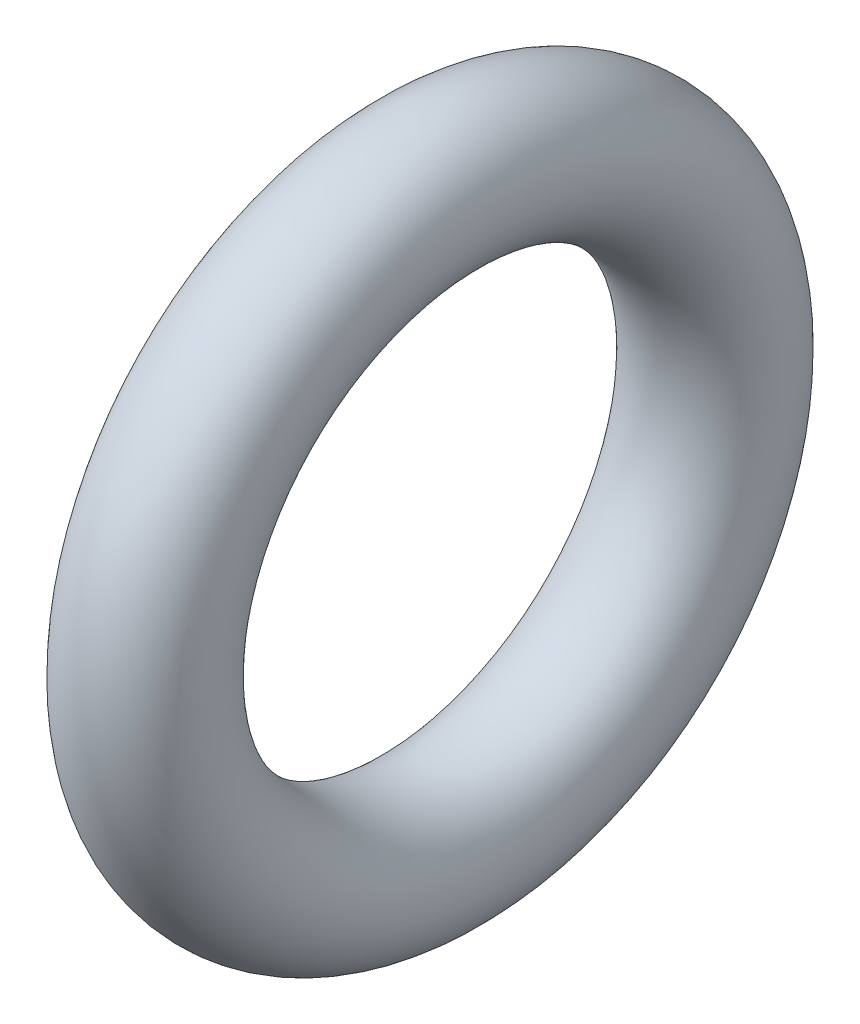
ISO-10303-21;
HEADER;
FILE_DESCRIPTION(('STEP AP214'),'2;1');
FILE_NAME('part.step','',(''),(''),'','','');
FILE_SCHEMA(('AUTOMOTIVE_DESIGN { 1 0 10303 214 1 1 1 1 }'));
ENDSEC;
DATA;
#1=APPLICATION_CONTEXT('core data for automotive mechanical design processes');
#2=APPLICATION_PROTOCOL_DEFINITION('international standard','automotive_design',2000,#1);
#3=PRODUCT_CONTEXT('',#1,'mechanical');
#4=PRODUCT('Part','Part','',(#3));
#5=PRODUCT_RELATED_PRODUCT_CATEGORY('part','',(#4));
#6=PRODUCT_DEFINITION_FORMATION('','',#4);
#7=PRODUCT_DEFINITION_CONTEXT('part definition',#1,'design');
#8=PRODUCT_DEFINITION('design','',#6,#7);
#9=PRODUCT_DEFINITION_SHAPE('','',#8);
#10=(LENGTH_UNIT() NAMED_UNIT(*) SI_UNIT(.MILLI.,.METRE.));
#11=(NAMED_UNIT(*) PLANE_ANGLE_UNIT() SI_UNIT($,.RADIAN.));
#12=(NAMED_UNIT(*) SI_UNIT($,.STERADIAN.) SOLID_ANGLE_UNIT());
#13=UNCERTAINTY_MEASURE_WITH_UNIT(LENGTH_MEASURE(1.E-05),#10,'distance_accuracy_value','');
#14=(GEOMETRIC_REPRESENTATION_CONTEXT(3) GLOBAL_UNCERTAINTY_ASSIGNED_CONTEXT((#13)) GLOBAL_UNIT_ASSIGNED_CONTEXT((#10,
#11,#12)) REPRESENTATION_CONTEXT('',''));
#15=CARTESIAN_POINT('',(0.,0.,0.));
#16=DIRECTION('',(0.,0.,1.));
#17=DIRECTION('',(1.,0.,0.));
#18=AXIS2_PLACEMENT_3D('',#15,#16,#17);
#19=CARTESIAN_POINT('',(0.,0.,0.));
#20=DIRECTION('',(-1.,0.,0.));
#21=DIRECTION('',(0.,0.,1.));
#22=AXIS2_PLACEMENT_3D('',#19,#20,#21);
#23=TOROIDAL_SURFACE('',#22,4.1,1.);
#24=CARTESIAN_POINT('',(0.,0.,5.1));
#25=VERTEX_POINT('',#24);
#26=VERTEX_LOOP('',#25);
#27=FACE_BOUND('',#26,.T.);
#28=ADVANCED_FACE('F39',(#27),#23,.T.);
#29=CLOSED_SHELL('',(#28));
#30=MANIFOLD_SOLID_BREP('B2',#29);
#31=ADVANCED_BREP_SHAPE_REPRESENTATION('',(#18,#30),#14);
#32=SHAPE_DEFINITION_REPRESENTATION(#9,#31);
ENDSEC;
END-ISO-10303-21;
